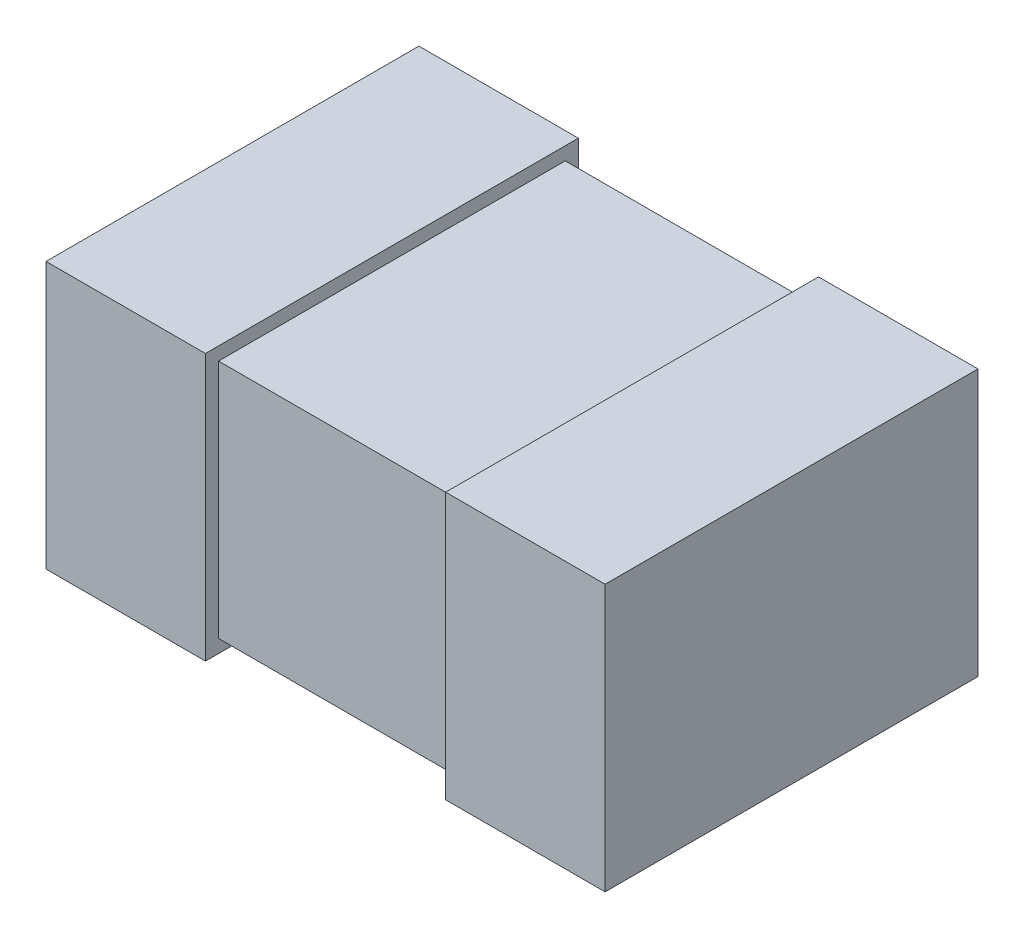
ISO-10303-21;
HEADER;
FILE_DESCRIPTION(('STEP AP214'),'2;1');
FILE_NAME('part.step','',(''),(''),'','','');
FILE_SCHEMA(('AUTOMOTIVE_DESIGN { 1 0 10303 214 1 1 1 1 }'));
ENDSEC;
DATA;
#1=APPLICATION_CONTEXT('core data for automotive mechanical design processes');
#2=APPLICATION_PROTOCOL_DEFINITION('international standard','automotive_design',2000,#1);
#3=PRODUCT_CONTEXT('',#1,'mechanical');
#4=PRODUCT('Part','Part','',(#3));
#5=PRODUCT_RELATED_PRODUCT_CATEGORY('part','',(#4));
#6=PRODUCT_DEFINITION_FORMATION('','',#4);
#7=PRODUCT_DEFINITION_CONTEXT('part definition',#1,'design');
#8=PRODUCT_DEFINITION('design','',#6,#7);
#9=PRODUCT_DEFINITION_SHAPE('','',#8);
#10=(LENGTH_UNIT() NAMED_UNIT(*) SI_UNIT(.MILLI.,.METRE.));
#11=(NAMED_UNIT(*) PLANE_ANGLE_UNIT() SI_UNIT($,.RADIAN.));
#12=(NAMED_UNIT(*) SI_UNIT($,.STERADIAN.) SOLID_ANGLE_UNIT());
#13=UNCERTAINTY_MEASURE_WITH_UNIT(LENGTH_MEASURE(1.E-05),#10,'distance_accuracy_value','');
#14=(GEOMETRIC_REPRESENTATION_CONTEXT(3) GLOBAL_UNCERTAINTY_ASSIGNED_CONTEXT((#13)) GLOBAL_UNIT_ASSIGNED_CONTEXT((#10,
#11,#12)) REPRESENTATION_CONTEXT('',''));
#15=CARTESIAN_POINT('',(0.,0.,0.));
#16=DIRECTION('',(0.,0.,1.));
#17=DIRECTION('',(1.,0.,0.));
#18=AXIS2_PLACEMENT_3D('',#15,#16,#17);
#19=CARTESIAN_POINT('',(0.229,0.229,0.025));
#20=DIRECTION('',(0.,-1.,0.));
#21=DIRECTION('',(0.,0.,-1.));
#22=AXIS2_PLACEMENT_3D('',#19,#20,#21);
#23=PLANE('',#22);
#24=DIRECTION('',(0.,0.,-1.));
#25=VECTOR('',#24,1.);
#26=CARTESIAN_POINT('',(-0.229,0.229,0.025));
#27=LINE('',#26,#25);
#28=CARTESIAN_POINT('',(-0.229,0.229,0.025));
#29=VERTEX_POINT('',#28);
#30=CARTESIAN_POINT('',(-0.229,0.229,0.686));
#31=VERTEX_POINT('',#30);
#32=EDGE_CURVE('P0_E19',#29,#31,#27,.F.);
#33=ORIENTED_EDGE('',*,*,#32,.T.);
#34=DIRECTION('',(-1.,0.,0.));
#35=VECTOR('',#34,1.);
#36=CARTESIAN_POINT('',(-0.229,0.229,0.686));
#37=LINE('',#36,#35);
#38=CARTESIAN_POINT('',(0.229,0.229,0.686));
#39=VERTEX_POINT('',#38);
#40=EDGE_CURVE('P0_E54',#31,#39,#37,.F.);
#41=ORIENTED_EDGE('',*,*,#40,.T.);
#42=DIRECTION('',(0.,0.,1.));
#43=VECTOR('',#42,1.);
#44=CARTESIAN_POINT('',(0.229,0.229,0.025));
#45=LINE('',#44,#43);
#46=CARTESIAN_POINT('',(0.229,0.229,0.025));
#47=VERTEX_POINT('',#46);
#48=EDGE_CURVE('P0_E75',#39,#47,#45,.F.);
#49=ORIENTED_EDGE('',*,*,#48,.T.);
#50=DIRECTION('',(1.,0.,0.));
#51=VECTOR('',#50,1.);
#52=CARTESIAN_POINT('',(-0.229,0.229,0.025));
#53=LINE('',#52,#51);
#54=EDGE_CURVE('P0_E57',#47,#29,#53,.F.);
#55=ORIENTED_EDGE('',*,*,#54,.T.);
#56=EDGE_LOOP('',(#33,#41,#49,#55));
#57=FACE_BOUND('',#56,.T.);
#58=ADVANCED_FACE('P0_F16',(#57),#23,.F.);
#59=CARTESIAN_POINT('',(-0.229,0.229,0.025));
#60=DIRECTION('',(1.,0.,0.));
#61=DIRECTION('',(0.,0.,-1.));
#62=AXIS2_PLACEMENT_3D('',#59,#60,#61);
#63=PLANE('',#62);
#64=DIRECTION('',(0.,0.,1.));
#65=VECTOR('',#64,1.);
#66=CARTESIAN_POINT('',(-0.229,-0.229,0.025));
#67=LINE('',#66,#65);
#68=CARTESIAN_POINT('',(-0.229,-0.229,0.025));
#69=VERTEX_POINT('',#68);
#70=CARTESIAN_POINT('',(-0.229,-0.229,0.686));
#71=VERTEX_POINT('',#70);
#72=EDGE_CURVE('P0_E72',#69,#71,#67,.T.);
#73=ORIENTED_EDGE('',*,*,#72,.T.);
#74=DIRECTION('',(0.,1.,0.));
#75=VECTOR('',#74,1.);
#76=CARTESIAN_POINT('',(-0.229,-0.229,0.686));
#77=LINE('',#76,#75);
#78=EDGE_CURVE('P0_E62',#71,#31,#77,.T.);
#79=ORIENTED_EDGE('',*,*,#78,.T.);
#80=ORIENTED_EDGE('',*,*,#32,.F.);
#81=DIRECTION('',(0.,1.,0.));
#82=VECTOR('',#81,1.);
#83=CARTESIAN_POINT('',(-0.229,0.229,0.025));
#84=LINE('',#83,#82);
#85=EDGE_CURVE('P0_E77',#29,#69,#84,.F.);
#86=ORIENTED_EDGE('',*,*,#85,.T.);
#87=EDGE_LOOP('',(#73,#79,#80,#86));
#88=FACE_BOUND('',#87,.T.);
#89=ADVANCED_FACE('P0_F71',(#88),#63,.F.);
#90=CARTESIAN_POINT('',(-0.229,-0.229,0.686));
#91=DIRECTION('',(0.,0.,-1.));
#92=DIRECTION('',(-1.,0.,0.));
#93=AXIS2_PLACEMENT_3D('',#90,#91,#92);
#94=PLANE('',#93);
#95=DIRECTION('',(0.,1.,0.));
#96=VECTOR('',#95,1.);
#97=CARTESIAN_POINT('',(0.229,-0.229,0.686));
#98=LINE('',#97,#96);
#99=CARTESIAN_POINT('',(0.229,-0.229,0.686));
#100=VERTEX_POINT('',#99);
#101=EDGE_CURVE('P0_E68',#100,#39,#98,.T.);
#102=ORIENTED_EDGE('',*,*,#101,.T.);
#103=ORIENTED_EDGE('',*,*,#40,.F.);
#104=ORIENTED_EDGE('',*,*,#78,.F.);
#105=DIRECTION('',(1.,0.,0.));
#106=VECTOR('',#105,1.);
#107=CARTESIAN_POINT('',(-0.229,-0.229,0.686));
#108=LINE('',#107,#106);
#109=EDGE_CURVE('P0_E82',#71,#100,#108,.T.);
#110=ORIENTED_EDGE('',*,*,#109,.T.);
#111=EDGE_LOOP('',(#102,#103,#104,#110));
#112=FACE_BOUND('',#111,.T.);
#113=ADVANCED_FACE('P0_F65',(#112),#94,.F.);
#114=CARTESIAN_POINT('',(0.229,-0.229,0.025));
#115=DIRECTION('',(-1.,0.,0.));
#116=DIRECTION('',(0.,0.,1.));
#117=AXIS2_PLACEMENT_3D('',#114,#115,#116);
#118=PLANE('',#117);
#119=ORIENTED_EDGE('',*,*,#48,.F.);
#120=ORIENTED_EDGE('',*,*,#101,.F.);
#121=DIRECTION('',(0.,0.,1.));
#122=VECTOR('',#121,1.);
#123=CARTESIAN_POINT('',(0.229,-0.229,0.025));
#124=LINE('',#123,#122);
#125=CARTESIAN_POINT('',(0.229,-0.229,0.025));
#126=VERTEX_POINT('',#125);
#127=EDGE_CURVE('P0_E25',#100,#126,#124,.F.);
#128=ORIENTED_EDGE('',*,*,#127,.T.);
#129=DIRECTION('',(0.,1.,0.));
#130=VECTOR('',#129,1.);
#131=CARTESIAN_POINT('',(0.229,0.229,0.025));
#132=LINE('',#131,#130);
#133=EDGE_CURVE('P0_E33',#126,#47,#132,.T.);
#134=ORIENTED_EDGE('',*,*,#133,.T.);
#135=EDGE_LOOP('',(#119,#120,#128,#134));
#136=FACE_BOUND('',#135,.T.);
#137=ADVANCED_FACE('P0_F87',(#136),#118,.F.);
#138=CARTESIAN_POINT('',(-0.229,0.229,0.025));
#139=DIRECTION('',(0.,0.,1.));
#140=DIRECTION('',(1.,0.,0.));
#141=AXIS2_PLACEMENT_3D('',#138,#139,#140);
#142=PLANE('',#141);
#143=ORIENTED_EDGE('',*,*,#133,.F.);
#144=DIRECTION('',(1.,0.,0.));
#145=VECTOR('',#144,1.);
#146=CARTESIAN_POINT('',(-0.229,-0.229,0.025));
#147=LINE('',#146,#145);
#148=EDGE_CURVE('P0_E10',#126,#69,#147,.F.);
#149=ORIENTED_EDGE('',*,*,#148,.T.);
#150=ORIENTED_EDGE('',*,*,#85,.F.);
#151=ORIENTED_EDGE('',*,*,#54,.F.);
#152=EDGE_LOOP('',(#143,#149,#150,#151));
#153=FACE_BOUND('',#152,.T.);
#154=ADVANCED_FACE('P0_F90',(#153),#142,.F.);
#155=CARTESIAN_POINT('',(-0.229,-0.229,0.025));
#156=DIRECTION('',(0.,1.,0.));
#157=DIRECTION('',(0.,0.,1.));
#158=AXIS2_PLACEMENT_3D('',#155,#156,#157);
#159=PLANE('',#158);
#160=ORIENTED_EDGE('',*,*,#127,.F.);
#161=ORIENTED_EDGE('',*,*,#109,.F.);
#162=ORIENTED_EDGE('',*,*,#72,.F.);
#163=ORIENTED_EDGE('',*,*,#148,.F.);
#164=EDGE_LOOP('',(#160,#161,#162,#163));
#165=FACE_BOUND('',#164,.T.);
#166=ADVANCED_FACE('P0_F89',(#165),#159,.F.);
#167=CLOSED_SHELL('',(#58,#89,#113,#137,#154,#166));
#168=MANIFOLD_SOLID_BREP('P0_B1',#167);
#169=CARTESIAN_POINT('',(-0.533,0.254,0.));
#170=DIRECTION('',(1.,0.,0.));
#171=DIRECTION('',(0.,0.,-1.));
#172=AXIS2_PLACEMENT_3D('',#169,#170,#171);
#173=PLANE('',#172);
#174=DIRECTION('',(0.,0.,1.));
#175=VECTOR('',#174,1.);
#176=CARTESIAN_POINT('',(-0.533,-0.254,0.));
#177=LINE('',#176,#175);
#178=CARTESIAN_POINT('',(-0.533,-0.254,0.));
#179=VERTEX_POINT('',#178);
#180=CARTESIAN_POINT('',(-0.533,-0.254,0.711));
#181=VERTEX_POINT('',#180);
#182=EDGE_CURVE('P1_E20',#179,#181,#177,.T.);
#183=ORIENTED_EDGE('',*,*,#182,.T.);
#184=DIRECTION('',(0.,1.,0.));
#185=VECTOR('',#184,1.);
#186=CARTESIAN_POINT('',(-0.533,-0.254,0.711));
#187=LINE('',#186,#185);
#188=CARTESIAN_POINT('',(-0.533,0.254,0.711));
#189=VERTEX_POINT('',#188);
#190=EDGE_CURVE('P1_E55',#181,#189,#187,.T.);
#191=ORIENTED_EDGE('',*,*,#190,.T.);
#192=DIRECTION('',(0.,0.,-1.));
#193=VECTOR('',#192,1.);
#194=CARTESIAN_POINT('',(-0.533,0.254,0.));
#195=LINE('',#194,#193);
#196=CARTESIAN_POINT('',(-0.533,0.254,0.));
#197=VERTEX_POINT('',#196);
#198=EDGE_CURVE('P1_E74',#189,#197,#195,.T.);
#199=ORIENTED_EDGE('',*,*,#198,.T.);
#200=DIRECTION('',(0.,1.,0.));
#201=VECTOR('',#200,1.);
#202=CARTESIAN_POINT('',(-0.533,0.254,0.));
#203=LINE('',#202,#201);
#204=EDGE_CURVE('P1_E66',#197,#179,#203,.F.);
#205=ORIENTED_EDGE('',*,*,#204,.T.);
#206=EDGE_LOOP('',(#183,#191,#199,#205));
#207=FACE_BOUND('',#206,.T.);
#208=ADVANCED_FACE('P1_F17',(#207),#173,.F.);
#209=CARTESIAN_POINT('',(-0.533,-0.254,0.));
#210=DIRECTION('',(0.,1.,0.));
#211=DIRECTION('',(0.,0.,1.));
#212=AXIS2_PLACEMENT_3D('',#209,#210,#211);
#213=PLANE('',#212);
#214=DIRECTION('',(0.,0.,1.));
#215=VECTOR('',#214,1.);
#216=CARTESIAN_POINT('',(-0.229,-0.254,0.));
#217=LINE('',#216,#215);
#218=CARTESIAN_POINT('',(-0.229,-0.254,0.));
#219=VERTEX_POINT('',#218);
#220=CARTESIAN_POINT('',(-0.229,-0.254,0.711));
#221=VERTEX_POINT('',#220);
#222=EDGE_CURVE('P1_E72',#219,#221,#217,.T.);
#223=ORIENTED_EDGE('',*,*,#222,.T.);
#224=DIRECTION('',(-1.,0.,0.));
#225=VECTOR('',#224,1.);
#226=CARTESIAN_POINT('',(-0.533,-0.254,0.711));
#227=LINE('',#226,#225);
#228=EDGE_CURVE('P1_E62',#221,#181,#227,.T.);
#229=ORIENTED_EDGE('',*,*,#228,.T.);
#230=ORIENTED_EDGE('',*,*,#182,.F.);
#231=DIRECTION('',(1.,0.,0.));
#232=VECTOR('',#231,1.);
#233=CARTESIAN_POINT('',(-0.533,-0.254,0.));
#234=LINE('',#233,#232);
#235=EDGE_CURVE('P1_E79',#179,#219,#234,.T.);
#236=ORIENTED_EDGE('',*,*,#235,.T.);
#237=EDGE_LOOP('',(#223,#229,#230,#236));
#238=FACE_BOUND('',#237,.T.);
#239=ADVANCED_FACE('P1_F71',(#238),#213,.F.);
#240=CARTESIAN_POINT('',(-0.533,-0.254,0.711));
#241=DIRECTION('',(0.,0.,-1.));
#242=DIRECTION('',(-1.,0.,0.));
#243=AXIS2_PLACEMENT_3D('',#240,#241,#242);
#244=PLANE('',#243);
#245=DIRECTION('',(0.,1.,0.));
#246=VECTOR('',#245,1.);
#247=CARTESIAN_POINT('',(-0.229,-0.254,0.711));
#248=LINE('',#247,#246);
#249=CARTESIAN_POINT('',(-0.229,0.254,0.711));
#250=VERTEX_POINT('',#249);
#251=EDGE_CURVE('P1_E83',#221,#250,#248,.T.);
#252=ORIENTED_EDGE('',*,*,#251,.T.);
#253=DIRECTION('',(1.,0.,0.));
#254=VECTOR('',#253,1.);
#255=CARTESIAN_POINT('',(-0.229,0.254,0.711));
#256=LINE('',#255,#254);
#257=EDGE_CURVE('P1_E64',#250,#189,#256,.F.);
#258=ORIENTED_EDGE('',*,*,#257,.T.);
#259=ORIENTED_EDGE('',*,*,#190,.F.);
#260=ORIENTED_EDGE('',*,*,#228,.F.);
#261=EDGE_LOOP('',(#252,#258,#259,#260));
#262=FACE_BOUND('',#261,.T.);
#263=ADVANCED_FACE('P1_F60',(#262),#244,.F.);
#264=CARTESIAN_POINT('',(-0.229,0.254,0.));
#265=DIRECTION('',(0.,-1.,0.));
#266=DIRECTION('',(0.,0.,-1.));
#267=AXIS2_PLACEMENT_3D('',#264,#265,#266);
#268=PLANE('',#267);
#269=ORIENTED_EDGE('',*,*,#198,.F.);
#270=ORIENTED_EDGE('',*,*,#257,.F.);
#271=DIRECTION('',(0.,0.,1.));
#272=VECTOR('',#271,1.);
#273=CARTESIAN_POINT('',(-0.229,0.254,0.));
#274=LINE('',#273,#272);
#275=CARTESIAN_POINT('',(-0.229,0.254,0.));
#276=VERTEX_POINT('',#275);
#277=EDGE_CURVE('P1_E26',#250,#276,#274,.F.);
#278=ORIENTED_EDGE('',*,*,#277,.T.);
#279=DIRECTION('',(1.,0.,0.));
#280=VECTOR('',#279,1.);
#281=CARTESIAN_POINT('',(-0.533,0.254,0.));
#282=LINE('',#281,#280);
#283=EDGE_CURVE('P1_E34',#276,#197,#282,.F.);
#284=ORIENTED_EDGE('',*,*,#283,.T.);
#285=EDGE_LOOP('',(#269,#270,#278,#284));
#286=FACE_BOUND('',#285,.T.);
#287=ADVANCED_FACE('P1_F88',(#286),#268,.F.);
#288=CARTESIAN_POINT('',(-0.533,0.254,0.));
#289=DIRECTION('',(0.,0.,1.));
#290=DIRECTION('',(1.,0.,0.));
#291=AXIS2_PLACEMENT_3D('',#288,#289,#290);
#292=PLANE('',#291);
#293=DIRECTION('',(0.,1.,0.));
#294=VECTOR('',#293,1.);
#295=CARTESIAN_POINT('',(-0.229,-0.254,0.));
#296=LINE('',#295,#294);
#297=EDGE_CURVE('P1_E11',#276,#219,#296,.F.);
#298=ORIENTED_EDGE('',*,*,#297,.T.);
#299=ORIENTED_EDGE('',*,*,#235,.F.);
#300=ORIENTED_EDGE('',*,*,#204,.F.);
#301=ORIENTED_EDGE('',*,*,#283,.F.);
#302=EDGE_LOOP('',(#298,#299,#300,#301));
#303=FACE_BOUND('',#302,.T.);
#304=ADVANCED_FACE('P1_F91',(#303),#292,.F.);
#305=CARTESIAN_POINT('',(-0.229,-0.254,0.));
#306=DIRECTION('',(-1.,0.,0.));
#307=DIRECTION('',(0.,0.,1.));
#308=AXIS2_PLACEMENT_3D('',#305,#306,#307);
#309=PLANE('',#308);
#310=ORIENTED_EDGE('',*,*,#277,.F.);
#311=ORIENTED_EDGE('',*,*,#251,.F.);
#312=ORIENTED_EDGE('',*,*,#222,.F.);
#313=ORIENTED_EDGE('',*,*,#297,.F.);
#314=EDGE_LOOP('',(#310,#311,#312,#313));
#315=FACE_BOUND('',#314,.T.);
#316=ADVANCED_FACE('P1_F90',(#315),#309,.F.);
#317=CLOSED_SHELL('',(#208,#239,#263,#287,#304,#316));
#318=MANIFOLD_SOLID_BREP('P1_B1',#317);
#319=CARTESIAN_POINT('',(0.229,0.254,0.));
#320=DIRECTION('',(1.,0.,0.));
#321=DIRECTION('',(0.,0.,-1.));
#322=AXIS2_PLACEMENT_3D('',#319,#320,#321);
#323=PLANE('',#322);
#324=DIRECTION('',(0.,0.,1.));
#325=VECTOR('',#324,1.);
#326=CARTESIAN_POINT('',(0.229,-0.254,0.));
#327=LINE('',#326,#325);
#328=CARTESIAN_POINT('',(0.229,-0.254,0.));
#329=VERTEX_POINT('',#328);
#330=CARTESIAN_POINT('',(0.229,-0.254,0.711));
#331=VERTEX_POINT('',#330);
#332=EDGE_CURVE('P2_E21',#329,#331,#327,.T.);
#333=ORIENTED_EDGE('',*,*,#332,.T.);
#334=DIRECTION('',(0.,1.,0.));
#335=VECTOR('',#334,1.);
#336=CARTESIAN_POINT('',(0.229,-0.254,0.711));
#337=LINE('',#336,#335);
#338=CARTESIAN_POINT('',(0.229,0.254,0.711));
#339=VERTEX_POINT('',#338);
#340=EDGE_CURVE('P2_E56',#331,#339,#337,.T.);
#341=ORIENTED_EDGE('',*,*,#340,.T.);
#342=DIRECTION('',(0.,0.,-1.));
#343=VECTOR('',#342,1.);
#344=CARTESIAN_POINT('',(0.229,0.254,0.));
#345=LINE('',#344,#343);
#346=CARTESIAN_POINT('',(0.229,0.254,0.));
#347=VERTEX_POINT('',#346);
#348=EDGE_CURVE('P2_E75',#339,#347,#345,.T.);
#349=ORIENTED_EDGE('',*,*,#348,.T.);
#350=DIRECTION('',(0.,1.,0.));
#351=VECTOR('',#350,1.);
#352=CARTESIAN_POINT('',(0.229,0.254,0.));
#353=LINE('',#352,#351);
#354=EDGE_CURVE('P2_E67',#347,#329,#353,.F.);
#355=ORIENTED_EDGE('',*,*,#354,.T.);
#356=EDGE_LOOP('',(#333,#341,#349,#355));
#357=FACE_BOUND('',#356,.T.);
#358=ADVANCED_FACE('P2_F18',(#357),#323,.F.);
#359=CARTESIAN_POINT('',(0.229,-0.254,0.));
#360=DIRECTION('',(0.,1.,0.));
#361=DIRECTION('',(0.,0.,1.));
#362=AXIS2_PLACEMENT_3D('',#359,#360,#361);
#363=PLANE('',#362);
#364=DIRECTION('',(0.,0.,1.));
#365=VECTOR('',#364,1.);
#366=CARTESIAN_POINT('',(0.533,-0.254,0.));
#367=LINE('',#366,#365);
#368=CARTESIAN_POINT('',(0.533,-0.254,0.));
#369=VERTEX_POINT('',#368);
#370=CARTESIAN_POINT('',(0.533,-0.254,0.711));
#371=VERTEX_POINT('',#370);
#372=EDGE_CURVE('P2_E73',#369,#371,#367,.T.);
#373=ORIENTED_EDGE('',*,*,#372,.T.);
#374=DIRECTION('',(-1.,0.,0.));
#375=VECTOR('',#374,1.);
#376=CARTESIAN_POINT('',(0.229,-0.254,0.711));
#377=LINE('',#376,#375);
#378=EDGE_CURVE('P2_E63',#371,#331,#377,.T.);
#379=ORIENTED_EDGE('',*,*,#378,.T.);
#380=ORIENTED_EDGE('',*,*,#332,.F.);
#381=DIRECTION('',(1.,0.,0.));
#382=VECTOR('',#381,1.);
#383=CARTESIAN_POINT('',(0.229,-0.254,0.));
#384=LINE('',#383,#382);
#385=EDGE_CURVE('P2_E80',#329,#369,#384,.T.);
#386=ORIENTED_EDGE('',*,*,#385,.T.);
#387=EDGE_LOOP('',(#373,#379,#380,#386));
#388=FACE_BOUND('',#387,.T.);
#389=ADVANCED_FACE('P2_F72',(#388),#363,.F.);
#390=CARTESIAN_POINT('',(0.229,-0.254,0.711));
#391=DIRECTION('',(0.,0.,-1.));
#392=DIRECTION('',(-1.,0.,0.));
#393=AXIS2_PLACEMENT_3D('',#390,#391,#392);
#394=PLANE('',#393);
#395=DIRECTION('',(0.,1.,0.));
#396=VECTOR('',#395,1.);
#397=CARTESIAN_POINT('',(0.533,-0.254,0.711));
#398=LINE('',#397,#396);
#399=CARTESIAN_POINT('',(0.533,0.254,0.711));
#400=VERTEX_POINT('',#399);
#401=EDGE_CURVE('P2_E84',#371,#400,#398,.T.);
#402=ORIENTED_EDGE('',*,*,#401,.T.);
#403=DIRECTION('',(1.,0.,0.));
#404=VECTOR('',#403,1.);
#405=CARTESIAN_POINT('',(0.533,0.254,0.711));
#406=LINE('',#405,#404);
#407=EDGE_CURVE('P2_E65',#400,#339,#406,.F.);
#408=ORIENTED_EDGE('',*,*,#407,.T.);
#409=ORIENTED_EDGE('',*,*,#340,.F.);
#410=ORIENTED_EDGE('',*,*,#378,.F.);
#411=EDGE_LOOP('',(#402,#408,#409,#410));
#412=FACE_BOUND('',#411,.T.);
#413=ADVANCED_FACE('P2_F61',(#412),#394,.F.);
#414=CARTESIAN_POINT('',(0.533,0.254,0.));
#415=DIRECTION('',(0.,-1.,0.));
#416=DIRECTION('',(0.,0.,-1.));
#417=AXIS2_PLACEMENT_3D('',#414,#415,#416);
#418=PLANE('',#417);
#419=ORIENTED_EDGE('',*,*,#348,.F.);
#420=ORIENTED_EDGE('',*,*,#407,.F.);
#421=DIRECTION('',(0.,0.,1.));
#422=VECTOR('',#421,1.);
#423=CARTESIAN_POINT('',(0.533,0.254,0.));
#424=LINE('',#423,#422);
#425=CARTESIAN_POINT('',(0.533,0.254,0.));
#426=VERTEX_POINT('',#425);
#427=EDGE_CURVE('P2_E27',#400,#426,#424,.F.);
#428=ORIENTED_EDGE('',*,*,#427,.T.);
#429=DIRECTION('',(1.,0.,0.));
#430=VECTOR('',#429,1.);
#431=CARTESIAN_POINT('',(0.229,0.254,0.));
#432=LINE('',#431,#430);
#433=EDGE_CURVE('P2_E35',#426,#347,#432,.F.);
#434=ORIENTED_EDGE('',*,*,#433,.T.);
#435=EDGE_LOOP('',(#419,#420,#428,#434));
#436=FACE_BOUND('',#435,.T.);
#437=ADVANCED_FACE('P2_F89',(#436),#418,.F.);
#438=CARTESIAN_POINT('',(0.229,0.254,0.));
#439=DIRECTION('',(0.,0.,1.));
#440=DIRECTION('',(1.,0.,0.));
#441=AXIS2_PLACEMENT_3D('',#438,#439,#440);
#442=PLANE('',#441);
#443=DIRECTION('',(0.,1.,0.));
#444=VECTOR('',#443,1.);
#445=CARTESIAN_POINT('',(0.533,-0.254,0.));
#446=LINE('',#445,#444);
#447=EDGE_CURVE('P2_E11',#426,#369,#446,.F.);
#448=ORIENTED_EDGE('',*,*,#447,.T.);
#449=ORIENTED_EDGE('',*,*,#385,.F.);
#450=ORIENTED_EDGE('',*,*,#354,.F.);
#451=ORIENTED_EDGE('',*,*,#433,.F.);
#452=EDGE_LOOP('',(#448,#449,#450,#451));
#453=FACE_BOUND('',#452,.T.);
#454=ADVANCED_FACE('P2_F92',(#453),#442,.F.);
#455=CARTESIAN_POINT('',(0.533,-0.254,0.));
#456=DIRECTION('',(-1.,0.,0.));
#457=DIRECTION('',(0.,0.,1.));
#458=AXIS2_PLACEMENT_3D('',#455,#456,#457);
#459=PLANE('',#458);
#460=ORIENTED_EDGE('',*,*,#427,.F.);
#461=ORIENTED_EDGE('',*,*,#401,.F.);
#462=ORIENTED_EDGE('',*,*,#372,.F.);
#463=ORIENTED_EDGE('',*,*,#447,.F.);
#464=EDGE_LOOP('',(#460,#461,#462,#463));
#465=FACE_BOUND('',#464,.T.);
#466=ADVANCED_FACE('P2_F91',(#465),#459,.F.);
#467=CLOSED_SHELL('',(#358,#389,#413,#437,#454,#466));
#468=MANIFOLD_SOLID_BREP('P2_B1',#467);
#469=ADVANCED_BREP_SHAPE_REPRESENTATION('',(#18,#168,#318,#468),#14);
#470=SHAPE_DEFINITION_REPRESENTATION(#9,#469);
ENDSEC;
END-ISO-10303-21;
